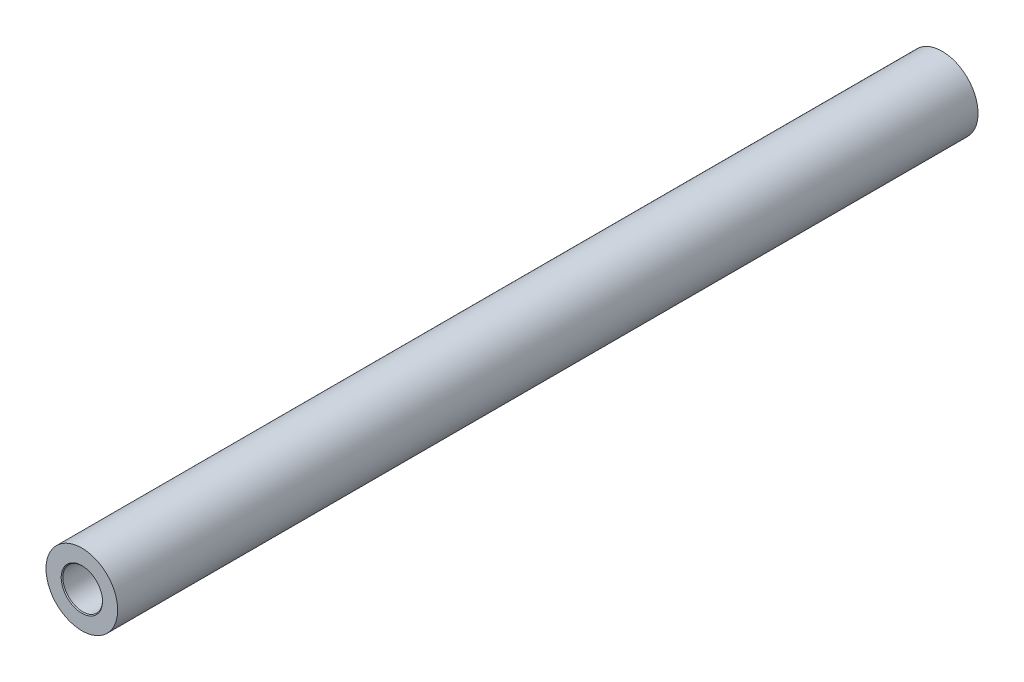
ISO-10303-21;
HEADER;
FILE_DESCRIPTION(('STEP AP214'),'2;1');
FILE_NAME('part.step','',(''),(''),'','','');
FILE_SCHEMA(('AUTOMOTIVE_DESIGN { 1 0 10303 214 1 1 1 1 }'));
ENDSEC;
DATA;
#1=APPLICATION_CONTEXT('core data for automotive mechanical design processes');
#2=APPLICATION_PROTOCOL_DEFINITION('international standard','automotive_design',2000,#1);
#3=PRODUCT_CONTEXT('',#1,'mechanical');
#4=PRODUCT('Part','Part','',(#3));
#5=PRODUCT_RELATED_PRODUCT_CATEGORY('part','',(#4));
#6=PRODUCT_DEFINITION_FORMATION('','',#4);
#7=PRODUCT_DEFINITION_CONTEXT('part definition',#1,'design');
#8=PRODUCT_DEFINITION('design','',#6,#7);
#9=PRODUCT_DEFINITION_SHAPE('','',#8);
#10=(LENGTH_UNIT() NAMED_UNIT(*) SI_UNIT(.MILLI.,.METRE.));
#11=(NAMED_UNIT(*) PLANE_ANGLE_UNIT() SI_UNIT($,.RADIAN.));
#12=(NAMED_UNIT(*) SI_UNIT($,.STERADIAN.) SOLID_ANGLE_UNIT());
#13=UNCERTAINTY_MEASURE_WITH_UNIT(LENGTH_MEASURE(1.E-05),#10,'distance_accuracy_value','');
#14=(GEOMETRIC_REPRESENTATION_CONTEXT(3) GLOBAL_UNCERTAINTY_ASSIGNED_CONTEXT((#13)) GLOBAL_UNIT_ASSIGNED_CONTEXT((#10,
#11,#12)) REPRESENTATION_CONTEXT('',''));
#15=CARTESIAN_POINT('',(0.,0.,0.));
#16=DIRECTION('',(0.,0.,1.));
#17=DIRECTION('',(1.,0.,0.));
#18=AXIS2_PLACEMENT_3D('',#15,#16,#17);
#19=CARTESIAN_POINT('',(0.,0.,38.1));
#20=DIRECTION('',(0.,0.,-1.));
#21=DIRECTION('',(-1.,0.,0.));
#22=AXIS2_PLACEMENT_3D('',#19,#20,#21);
#23=CYLINDRICAL_SURFACE('',#22,3.175);
#24=CARTESIAN_POINT('',(0.,0.,38.1));
#25=DIRECTION('',(0.,0.,1.));
#26=DIRECTION('',(1.,0.,0.));
#27=AXIS2_PLACEMENT_3D('',#24,#25,#26);
#28=CIRCLE('',#27,3.175);
#29=CARTESIAN_POINT('',(-3.175,0.,38.1));
#30=VERTEX_POINT('',#29);
#31=EDGE_CURVE('E10',#30,#30,#28,.T.);
#32=CARTESIAN_POINT('',(0.,0.,-38.1));
#33=DIRECTION('',(0.,0.,1.));
#34=DIRECTION('',(1.,0.,0.));
#35=AXIS2_PLACEMENT_3D('',#32,#33,#34);
#36=CIRCLE('',#35,3.175);
#37=CARTESIAN_POINT('',(-3.175,0.,-38.1));
#38=VERTEX_POINT('',#37);
#39=EDGE_CURVE('E50',#38,#38,#36,.T.);
#40=CARTESIAN_POINT('',(-3.175,0.,38.1));
#41=CARTESIAN_POINT('',(-3.175,0.,37.30625));
#42=CARTESIAN_POINT('',(-3.175,0.,36.5125));
#43=CARTESIAN_POINT('',(-3.175,0.,34.925));
#44=CARTESIAN_POINT('',(-3.175,0.,34.13125));
#45=CARTESIAN_POINT('',(-3.175,0.,32.54375));
#46=CARTESIAN_POINT('',(-3.175,0.,31.75));
#47=CARTESIAN_POINT('',(-3.175,0.,30.1625));
#48=CARTESIAN_POINT('',(-3.175,0.,29.36875));
#49=CARTESIAN_POINT('',(-3.175,0.,27.78125));
#50=CARTESIAN_POINT('',(-3.175,0.,26.9875));
#51=CARTESIAN_POINT('',(-3.175,0.,25.4));
#52=CARTESIAN_POINT('',(-3.175,0.,24.60625));
#53=CARTESIAN_POINT('',(-3.175,0.,23.01875));
#54=CARTESIAN_POINT('',(-3.175,0.,22.225));
#55=CARTESIAN_POINT('',(-3.175,0.,20.6375));
#56=CARTESIAN_POINT('',(-3.175,0.,19.84375));
#57=CARTESIAN_POINT('',(-3.175,0.,18.25625));
#58=CARTESIAN_POINT('',(-3.175,0.,17.4625));
#59=CARTESIAN_POINT('',(-3.175,0.,15.875));
#60=CARTESIAN_POINT('',(-3.175,0.,15.08125));
#61=CARTESIAN_POINT('',(-3.175,0.,13.49375));
#62=CARTESIAN_POINT('',(-3.175,0.,12.7));
#63=CARTESIAN_POINT('',(-3.175,0.,11.1125));
#64=CARTESIAN_POINT('',(-3.175,0.,10.31875));
#65=CARTESIAN_POINT('',(-3.175,0.,8.73124999999999));
#66=CARTESIAN_POINT('',(-3.175,0.,7.93749999999999));
#67=CARTESIAN_POINT('',(-3.175,0.,6.35));
#68=CARTESIAN_POINT('',(-3.175,0.,5.55625));
#69=CARTESIAN_POINT('',(-3.175,0.,3.96875));
#70=CARTESIAN_POINT('',(-3.175,0.,3.175));
#71=CARTESIAN_POINT('',(-3.175,0.,1.5875));
#72=CARTESIAN_POINT('',(-3.175,0.,0.793750000000001));
#73=CARTESIAN_POINT('',(-3.175,0.,-0.793750000000001));
#74=CARTESIAN_POINT('',(-3.175,0.,-1.5875));
#75=CARTESIAN_POINT('',(-3.175,0.,-3.175));
#76=CARTESIAN_POINT('',(-3.175,0.,-3.96875));
#77=CARTESIAN_POINT('',(-3.175,0.,-5.55625));
#78=CARTESIAN_POINT('',(-3.175,0.,-6.35));
#79=CARTESIAN_POINT('',(-3.175,0.,-7.93750000000001));
#80=CARTESIAN_POINT('',(-3.175,0.,-8.73125));
#81=CARTESIAN_POINT('',(-3.175,0.,-10.31875));
#82=CARTESIAN_POINT('',(-3.175,0.,-11.1125));
#83=CARTESIAN_POINT('',(-3.175,0.,-12.7));
#84=CARTESIAN_POINT('',(-3.175,0.,-13.49375));
#85=CARTESIAN_POINT('',(-3.175,0.,-15.08125));
#86=CARTESIAN_POINT('',(-3.175,0.,-15.875));
#87=CARTESIAN_POINT('',(-3.175,0.,-17.4625));
#88=CARTESIAN_POINT('',(-3.175,0.,-18.25625));
#89=CARTESIAN_POINT('',(-3.175,0.,-19.84375));
#90=CARTESIAN_POINT('',(-3.175,0.,-20.6375));
#91=CARTESIAN_POINT('',(-3.175,0.,-22.225));
#92=CARTESIAN_POINT('',(-3.175,0.,-23.01875));
#93=CARTESIAN_POINT('',(-3.175,0.,-24.60625));
#94=CARTESIAN_POINT('',(-3.175,0.,-25.4));
#95=CARTESIAN_POINT('',(-3.175,0.,-26.9875));
#96=CARTESIAN_POINT('',(-3.175,0.,-27.78125));
#97=CARTESIAN_POINT('',(-3.175,0.,-29.36875));
#98=CARTESIAN_POINT('',(-3.175,0.,-30.1625));
#99=CARTESIAN_POINT('',(-3.175,0.,-31.75));
#100=CARTESIAN_POINT('',(-3.175,0.,-32.54375));
#101=CARTESIAN_POINT('',(-3.175,0.,-34.13125));
#102=CARTESIAN_POINT('',(-3.175,0.,-34.925));
#103=CARTESIAN_POINT('',(-3.175,0.,-36.5125));
#104=CARTESIAN_POINT('',(-3.175,0.,-37.30625));
#105=CARTESIAN_POINT('',(-3.175,0.,-38.1));
#106=B_SPLINE_CURVE_WITH_KNOTS('',3,(#40,#41,#42,#43,#44,#45,#46,#47,#48,#49,#50,#51,#52,#53,
#54,#55,#56,#57,#58,#59,#60,#61,#62,#63,#64,#65,#66,#67,#68,#69,#70,#71,#72,#73,#74,#75,#76,#77,
#78,#79,#80,#81,#82,#83,#84,#85,#86,#87,#88,#89,#90,#91,#92,#93,#94,#95,#96,#97,#98,#99,#100,
#101,#102,#103,#104,#105),.UNSPECIFIED.,.F.,.F.,(4,2,2,2,2,2,2,2,2,2,2,2,2,2,2,2,2,2,2,2,2,2,2,
2,2,2,2,2,2,2,2,2,4),(0.,2.38125,4.7625,7.14375,9.52500000000001,11.90625,14.2875,16.66875,
19.05,21.43125,23.8125,26.19375,28.575,30.95625,33.3375,35.71875,38.1,40.48125,42.8625,45.24375,
47.625,50.00625,52.3875,54.76875,57.15,59.53125,61.9125,64.29375,66.675,69.05625,71.4375,
73.81875,76.2),.UNSPECIFIED.);
#107=EDGE_CURVE('BSEAM43',#30,#38,#106,.T.);
#108=ORIENTED_EDGE('',*,*,#31,.F.);
#109=ORIENTED_EDGE('',*,*,#39,.T.);
#110=ORIENTED_EDGE('',*,*,#107,.T.);
#111=ORIENTED_EDGE('',*,*,#107,.F.);
#112=EDGE_LOOP('',(#108,#110,#109,#111));
#113=FACE_BOUND('',#112,.T.);
#114=ADVANCED_FACE('F43',(#113),#23,.T.);
#115=CARTESIAN_POINT('',(0.,0.,38.1));
#116=DIRECTION('',(0.,0.,1.));
#117=DIRECTION('',(1.,0.,0.));
#118=AXIS2_PLACEMENT_3D('',#115,#116,#117);
#119=PLANE('',#118);
#120=CARTESIAN_POINT('',(0.,0.,38.1));
#121=DIRECTION('',(0.,0.,1.));
#122=DIRECTION('',(1.,0.,0.));
#123=AXIS2_PLACEMENT_3D('',#120,#121,#122);
#124=CIRCLE('',#123,1.8288);
#125=CARTESIAN_POINT('',(1.8288,0.,38.1));
#126=VERTEX_POINT('',#125);
#127=EDGE_CURVE('E78',#126,#126,#124,.T.);
#128=ORIENTED_EDGE('',*,*,#127,.F.);
#129=EDGE_LOOP('',(#128));
#130=FACE_BOUND('',#129,.T.);
#131=ORIENTED_EDGE('',*,*,#31,.T.);
#132=EDGE_LOOP('',(#131));
#133=FACE_BOUND('',#132,.T.);
#134=ADVANCED_FACE('F85',(#130,#133),#119,.T.);
#135=CARTESIAN_POINT('',(0.,0.,-38.1));
#136=DIRECTION('',(0.,0.,1.));
#137=DIRECTION('',(1.,0.,0.));
#138=AXIS2_PLACEMENT_3D('',#135,#136,#137);
#139=PLANE('',#138);
#140=CARTESIAN_POINT('',(0.,0.,-38.1));
#141=DIRECTION('',(0.,0.,-1.));
#142=DIRECTION('',(-1.,0.,0.));
#143=AXIS2_PLACEMENT_3D('',#140,#141,#142);
#144=CIRCLE('',#143,1.8288);
#145=CARTESIAN_POINT('',(-1.8288,0.,-38.1));
#146=VERTEX_POINT('',#145);
#147=EDGE_CURVE('E66',#146,#146,#144,.T.);
#148=ORIENTED_EDGE('',*,*,#147,.F.);
#149=EDGE_LOOP('',(#148));
#150=FACE_BOUND('',#149,.T.);
#151=ORIENTED_EDGE('',*,*,#39,.F.);
#152=EDGE_LOOP('',(#151));
#153=FACE_BOUND('',#152,.T.);
#154=ADVANCED_FACE('F87',(#150,#153),#139,.F.);
#155=CARTESIAN_POINT('',(0.,0.,-28.575));
#156=DIRECTION('',(0.,0.,-1.));
#157=DIRECTION('',(-1.,0.,0.));
#158=AXIS2_PLACEMENT_3D('',#155,#156,#157);
#159=CYLINDRICAL_SURFACE('',#158,1.7526);
#160=CARTESIAN_POINT('',(0.,0.,-38.0238));
#161=DIRECTION('',(0.,0.,-1.));
#162=DIRECTION('',(-1.,0.,0.));
#163=AXIS2_PLACEMENT_3D('',#160,#161,#162);
#164=CIRCLE('',#163,1.7526);
#165=CARTESIAN_POINT('',(-1.7526,0.,-38.0238));
#166=VERTEX_POINT('',#165);
#167=EDGE_CURVE('E55',#166,#166,#164,.T.);
#168=ORIENTED_EDGE('',*,*,#167,.T.);
#169=EDGE_LOOP('',(#168));
#170=FACE_BOUND('',#169,.T.);
#171=CARTESIAN_POINT('',(0.,0.,-28.575));
#172=DIRECTION('',(0.,0.,-1.));
#173=DIRECTION('',(-1.,0.,0.));
#174=AXIS2_PLACEMENT_3D('',#171,#172,#173);
#175=CIRCLE('',#174,1.7526);
#176=CARTESIAN_POINT('',(-1.7526,0.,-28.575));
#177=VERTEX_POINT('',#176);
#178=EDGE_CURVE('E60',#177,#177,#175,.T.);
#179=ORIENTED_EDGE('',*,*,#178,.F.);
#180=EDGE_LOOP('',(#179));
#181=FACE_BOUND('',#180,.T.);
#182=ADVANCED_FACE('F92',(#170,#181),#159,.F.);
#183=CARTESIAN_POINT('',(0.,0.,-28.575));
#184=DIRECTION('',(0.,0.,-1.));
#185=DIRECTION('',(-1.,0.,0.));
#186=AXIS2_PLACEMENT_3D('',#183,#184,#185);
#187=PLANE('',#186);
#188=ORIENTED_EDGE('',*,*,#178,.T.);
#189=EDGE_LOOP('',(#188));
#190=FACE_BOUND('',#189,.T.);
#191=ADVANCED_FACE('F99',(#190),#187,.T.);
#192=CARTESIAN_POINT('',(0.,0.,-38.1));
#193=DIRECTION('',(0.,0.,-1.));
#194=DIRECTION('',(-1.,0.,0.));
#195=AXIS2_PLACEMENT_3D('',#192,#193,#194);
#196=CONICAL_SURFACE('',#195,1.8288,0.78539816339745);
#197=ORIENTED_EDGE('',*,*,#167,.F.);
#198=EDGE_LOOP('',(#197));
#199=FACE_BOUND('',#198,.T.);
#200=ORIENTED_EDGE('',*,*,#147,.T.);
#201=EDGE_LOOP('',(#200));
#202=FACE_BOUND('',#201,.T.);
#203=ADVANCED_FACE('F103',(#199,#202),#196,.F.);
#204=CARTESIAN_POINT('',(0.,0.,28.575));
#205=DIRECTION('',(0.,0.,1.));
#206=DIRECTION('',(1.,0.,0.));
#207=AXIS2_PLACEMENT_3D('',#204,#205,#206);
#208=CYLINDRICAL_SURFACE('',#207,1.7526);
#209=CARTESIAN_POINT('',(0.,0.,38.0238));
#210=DIRECTION('',(0.,0.,1.));
#211=DIRECTION('',(1.,0.,0.));
#212=AXIS2_PLACEMENT_3D('',#209,#210,#211);
#213=CIRCLE('',#212,1.7526);
#214=CARTESIAN_POINT('',(1.7526,0.,38.0238));
#215=VERTEX_POINT('',#214);
#216=EDGE_CURVE('E70',#215,#215,#213,.T.);
#217=ORIENTED_EDGE('',*,*,#216,.T.);
#218=EDGE_LOOP('',(#217));
#219=FACE_BOUND('',#218,.T.);
#220=CARTESIAN_POINT('',(0.,0.,28.575));
#221=DIRECTION('',(0.,0.,1.));
#222=DIRECTION('',(1.,0.,0.));
#223=AXIS2_PLACEMENT_3D('',#220,#221,#222);
#224=CIRCLE('',#223,1.7526);
#225=CARTESIAN_POINT('',(1.7526,0.,28.575));
#226=VERTEX_POINT('',#225);
#227=EDGE_CURVE('E74',#226,#226,#224,.T.);
#228=ORIENTED_EDGE('',*,*,#227,.F.);
#229=EDGE_LOOP('',(#228));
#230=FACE_BOUND('',#229,.T.);
#231=ADVANCED_FACE('F107',(#219,#230),#208,.F.);
#232=CARTESIAN_POINT('',(0.,0.,28.575));
#233=DIRECTION('',(0.,0.,1.));
#234=DIRECTION('',(1.,0.,0.));
#235=AXIS2_PLACEMENT_3D('',#232,#233,#234);
#236=PLANE('',#235);
#237=ORIENTED_EDGE('',*,*,#227,.T.);
#238=EDGE_LOOP('',(#237));
#239=FACE_BOUND('',#238,.T.);
#240=ADVANCED_FACE('F111',(#239),#236,.T.);
#241=CARTESIAN_POINT('',(0.,0.,38.1));
#242=DIRECTION('',(0.,0.,1.));
#243=DIRECTION('',(1.,0.,0.));
#244=AXIS2_PLACEMENT_3D('',#241,#242,#243);
#245=CONICAL_SURFACE('',#244,1.8288,0.78539816339745);
#246=ORIENTED_EDGE('',*,*,#216,.F.);
#247=EDGE_LOOP('',(#246));
#248=FACE_BOUND('',#247,.T.);
#249=ORIENTED_EDGE('',*,*,#127,.T.);
#250=EDGE_LOOP('',(#249));
#251=FACE_BOUND('',#250,.T.);
#252=ADVANCED_FACE('F83',(#248,#251),#245,.F.);
#253=CLOSED_SHELL('',(#114,#134,#154,#182,#191,#203,#231,#240,#252));
#254=MANIFOLD_SOLID_BREP('B2',#253);
#255=ADVANCED_BREP_SHAPE_REPRESENTATION('',(#18,#254),#14);
#256=SHAPE_DEFINITION_REPRESENTATION(#9,#255);
ENDSEC;
END-ISO-10303-21;
